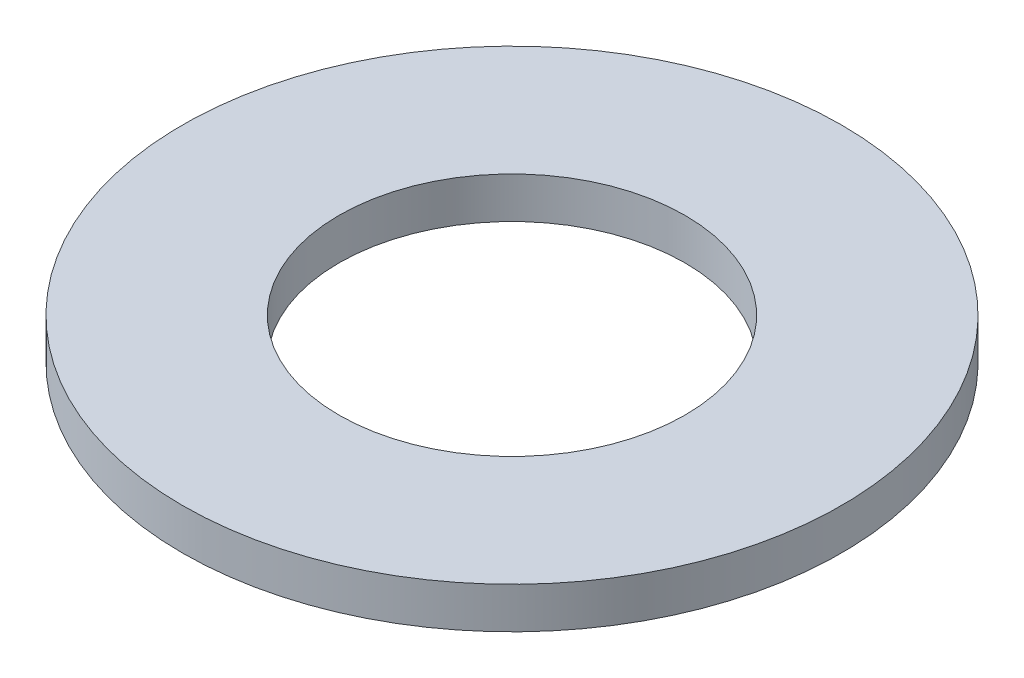
ISO-10303-21;
HEADER;
FILE_DESCRIPTION(('STEP AP214'),'2;1');
FILE_NAME('part.step','',(''),(''),'','','');
FILE_SCHEMA(('AUTOMOTIVE_DESIGN { 1 0 10303 214 1 1 1 1 }'));
ENDSEC;
DATA;
#1=APPLICATION_CONTEXT('core data for automotive mechanical design processes');
#2=APPLICATION_PROTOCOL_DEFINITION('international standard','automotive_design',2000,#1);
#3=PRODUCT_CONTEXT('',#1,'mechanical');
#4=PRODUCT('Part','Part','',(#3));
#5=PRODUCT_RELATED_PRODUCT_CATEGORY('part','',(#4));
#6=PRODUCT_DEFINITION_FORMATION('','',#4);
#7=PRODUCT_DEFINITION_CONTEXT('part definition',#1,'design');
#8=PRODUCT_DEFINITION('design','',#6,#7);
#9=PRODUCT_DEFINITION_SHAPE('','',#8);
#10=(LENGTH_UNIT() NAMED_UNIT(*) SI_UNIT(.MILLI.,.METRE.));
#11=(NAMED_UNIT(*) PLANE_ANGLE_UNIT() SI_UNIT($,.RADIAN.));
#12=(NAMED_UNIT(*) SI_UNIT($,.STERADIAN.) SOLID_ANGLE_UNIT());
#13=UNCERTAINTY_MEASURE_WITH_UNIT(LENGTH_MEASURE(1.E-05),#10,'distance_accuracy_value','');
#14=(GEOMETRIC_REPRESENTATION_CONTEXT(3) GLOBAL_UNCERTAINTY_ASSIGNED_CONTEXT((#13)) GLOBAL_UNIT_ASSIGNED_CONTEXT((#10,
#11,#12)) REPRESENTATION_CONTEXT('',''));
#15=CARTESIAN_POINT('',(0.,0.,0.));
#16=DIRECTION('',(0.,0.,1.));
#17=DIRECTION('',(1.,0.,0.));
#18=AXIS2_PLACEMENT_3D('',#15,#16,#17);
#19=CARTESIAN_POINT('',(0.,1.,0.));
#20=DIRECTION('',(0.,-1.,0.));
#21=DIRECTION('',(0.,0.,-1.));
#22=AXIS2_PLACEMENT_3D('',#19,#20,#21);
#23=CYLINDRICAL_SURFACE('',#22,4.2);
#24=CARTESIAN_POINT('',(0.,1.,0.));
#25=DIRECTION('',(0.,1.,0.));
#26=DIRECTION('',(0.,0.,1.));
#27=AXIS2_PLACEMENT_3D('',#24,#25,#26);
#28=CIRCLE('',#27,4.2);
#29=CARTESIAN_POINT('',(0.,1.,4.2));
#30=VERTEX_POINT('',#29);
#31=EDGE_CURVE('E53',#30,#30,#28,.T.);
#32=ORIENTED_EDGE('',*,*,#31,.T.);
#33=EDGE_LOOP('',(#32));
#34=FACE_BOUND('',#33,.T.);
#35=CARTESIAN_POINT('',(0.,0.,0.));
#36=DIRECTION('',(0.,1.,0.));
#37=DIRECTION('',(0.,0.,1.));
#38=AXIS2_PLACEMENT_3D('',#35,#36,#37);
#39=CIRCLE('',#38,4.2);
#40=CARTESIAN_POINT('',(0.,0.,4.2));
#41=VERTEX_POINT('',#40);
#42=EDGE_CURVE('E60',#41,#41,#39,.T.);
#43=ORIENTED_EDGE('',*,*,#42,.F.);
#44=EDGE_LOOP('',(#43));
#45=FACE_BOUND('',#44,.T.);
#46=ADVANCED_FACE('F45',(#34,#45),#23,.F.);
#47=CARTESIAN_POINT('',(0.,1.,0.));
#48=DIRECTION('',(0.,-1.,0.));
#49=DIRECTION('',(0.,0.,-1.));
#50=AXIS2_PLACEMENT_3D('',#47,#48,#49);
#51=CYLINDRICAL_SURFACE('',#50,8.);
#52=CARTESIAN_POINT('',(0.,1.,0.));
#53=DIRECTION('',(0.,1.,0.));
#54=DIRECTION('',(0.,0.,1.));
#55=AXIS2_PLACEMENT_3D('',#52,#53,#54);
#56=CIRCLE('',#55,8.);
#57=CARTESIAN_POINT('',(0.,1.,8.));
#58=VERTEX_POINT('',#57);
#59=EDGE_CURVE('E10',#58,#58,#56,.T.);
#60=ORIENTED_EDGE('',*,*,#59,.F.);
#61=EDGE_LOOP('',(#60));
#62=FACE_BOUND('',#61,.T.);
#63=CARTESIAN_POINT('',(0.,0.,0.));
#64=DIRECTION('',(0.,1.,0.));
#65=DIRECTION('',(0.,0.,1.));
#66=AXIS2_PLACEMENT_3D('',#63,#64,#65);
#67=CIRCLE('',#66,8.);
#68=CARTESIAN_POINT('',(0.,0.,8.));
#69=VERTEX_POINT('',#68);
#70=EDGE_CURVE('E48',#69,#69,#67,.T.);
#71=ORIENTED_EDGE('',*,*,#70,.T.);
#72=EDGE_LOOP('',(#71));
#73=FACE_BOUND('',#72,.T.);
#74=ADVANCED_FACE('F69',(#62,#73),#51,.T.);
#75=CARTESIAN_POINT('',(0.,1.,0.));
#76=DIRECTION('',(0.,1.,0.));
#77=DIRECTION('',(0.,0.,1.));
#78=AXIS2_PLACEMENT_3D('',#75,#76,#77);
#79=PLANE('',#78);
#80=ORIENTED_EDGE('',*,*,#31,.F.);
#81=EDGE_LOOP('',(#80));
#82=FACE_BOUND('',#81,.T.);
#83=ORIENTED_EDGE('',*,*,#59,.T.);
#84=EDGE_LOOP('',(#83));
#85=FACE_BOUND('',#84,.T.);
#86=ADVANCED_FACE('F73',(#82,#85),#79,.T.);
#87=CARTESIAN_POINT('',(0.,0.,0.));
#88=DIRECTION('',(0.,1.,0.));
#89=DIRECTION('',(0.,0.,1.));
#90=AXIS2_PLACEMENT_3D('',#87,#88,#89);
#91=PLANE('',#90);
#92=ORIENTED_EDGE('',*,*,#42,.T.);
#93=EDGE_LOOP('',(#92));
#94=FACE_BOUND('',#93,.T.);
#95=ORIENTED_EDGE('',*,*,#70,.F.);
#96=EDGE_LOOP('',(#95));
#97=FACE_BOUND('',#96,.T.);
#98=ADVANCED_FACE('F71',(#94,#97),#91,.F.);
#99=CLOSED_SHELL('',(#46,#74,#86,#98));
#100=MANIFOLD_SOLID_BREP('B2',#99);
#101=ADVANCED_BREP_SHAPE_REPRESENTATION('',(#18,#100),#14);
#102=SHAPE_DEFINITION_REPRESENTATION(#9,#101);
ENDSEC;
END-ISO-10303-21;
